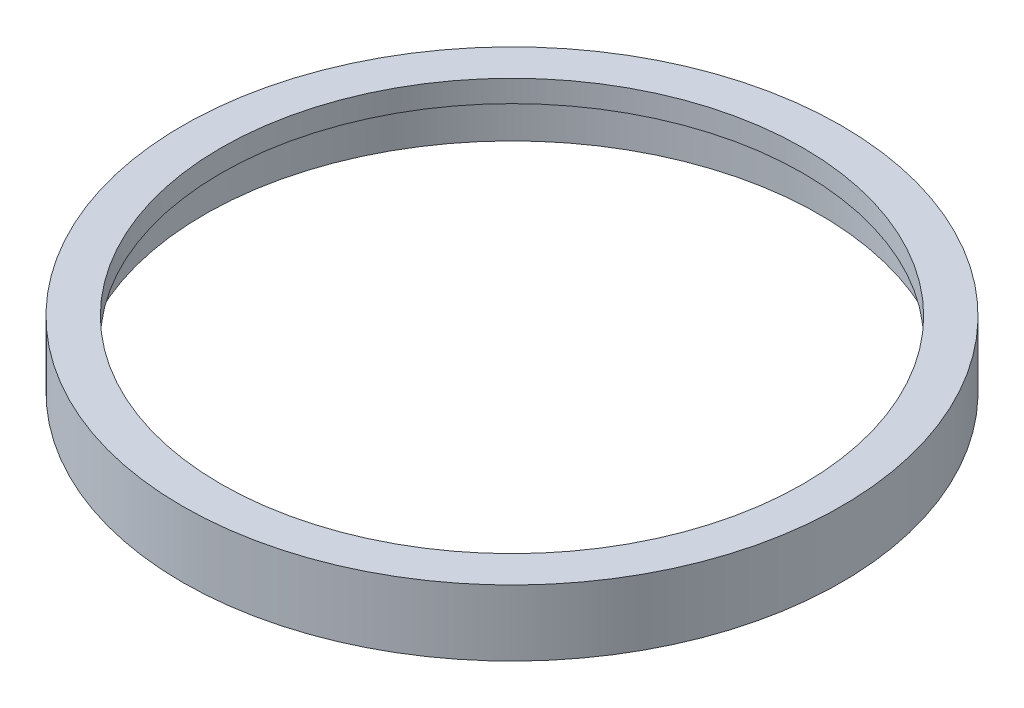
ISO-10303-21;
HEADER;
FILE_DESCRIPTION(('STEP AP214'),'2;1');
FILE_NAME('part.step','',(''),(''),'','','');
FILE_SCHEMA(('AUTOMOTIVE_DESIGN { 1 0 10303 214 1 1 1 1 }'));
ENDSEC;
DATA;
#1=APPLICATION_CONTEXT('core data for automotive mechanical design processes');
#2=APPLICATION_PROTOCOL_DEFINITION('international standard','automotive_design',2000,#1);
#3=PRODUCT_CONTEXT('',#1,'mechanical');
#4=PRODUCT('Part','Part','',(#3));
#5=PRODUCT_RELATED_PRODUCT_CATEGORY('part','',(#4));
#6=PRODUCT_DEFINITION_FORMATION('','',#4);
#7=PRODUCT_DEFINITION_CONTEXT('part definition',#1,'design');
#8=PRODUCT_DEFINITION('design','',#6,#7);
#9=PRODUCT_DEFINITION_SHAPE('','',#8);
#10=(LENGTH_UNIT() NAMED_UNIT(*) SI_UNIT(.MILLI.,.METRE.));
#11=(NAMED_UNIT(*) PLANE_ANGLE_UNIT() SI_UNIT($,.RADIAN.));
#12=(NAMED_UNIT(*) SI_UNIT($,.STERADIAN.) SOLID_ANGLE_UNIT());
#13=UNCERTAINTY_MEASURE_WITH_UNIT(LENGTH_MEASURE(1.E-05),#10,'distance_accuracy_value','');
#14=(GEOMETRIC_REPRESENTATION_CONTEXT(3) GLOBAL_UNCERTAINTY_ASSIGNED_CONTEXT((#13)) GLOBAL_UNIT_ASSIGNED_CONTEXT((#10,
#11,#12)) REPRESENTATION_CONTEXT('',''));
#15=CARTESIAN_POINT('',(0.,0.,0.));
#16=DIRECTION('',(0.,0.,1.));
#17=DIRECTION('',(1.,0.,0.));
#18=AXIS2_PLACEMENT_3D('',#15,#16,#17);
#19=CARTESIAN_POINT('',(0.,0.,0.));
#20=DIRECTION('',(0.,1.,0.));
#21=DIRECTION('',(0.,0.,1.));
#22=AXIS2_PLACEMENT_3D('',#19,#20,#21);
#23=PLANE('',#22);
#24=CARTESIAN_POINT('',(0.,0.,0.));
#25=DIRECTION('',(0.,1.,0.));
#26=DIRECTION('',(0.,0.,1.));
#27=AXIS2_PLACEMENT_3D('',#24,#25,#26);
#28=CIRCLE('',#27,15.);
#29=CARTESIAN_POINT('',(0.,0.,15.));
#30=VERTEX_POINT('',#29);
#31=EDGE_CURVE('E10',#30,#30,#28,.T.);
#32=ORIENTED_EDGE('',*,*,#31,.F.);
#33=EDGE_LOOP('',(#32));
#34=FACE_BOUND('',#33,.T.);
#35=CARTESIAN_POINT('',(0.,0.,0.));
#36=DIRECTION('',(0.,1.,0.));
#37=DIRECTION('',(0.,0.,1.));
#38=AXIS2_PLACEMENT_3D('',#35,#36,#37);
#39=CIRCLE('',#38,14.);
#40=CARTESIAN_POINT('',(0.,0.,14.));
#41=VERTEX_POINT('',#40);
#42=EDGE_CURVE('E38',#41,#41,#39,.T.);
#43=ORIENTED_EDGE('',*,*,#42,.T.);
#44=EDGE_LOOP('',(#43));
#45=FACE_BOUND('',#44,.T.);
#46=ADVANCED_FACE('F31',(#34,#45),#23,.F.);
#47=CARTESIAN_POINT('',(0.,2.,0.));
#48=DIRECTION('',(0.,-1.,0.));
#49=DIRECTION('',(0.,0.,-1.));
#50=AXIS2_PLACEMENT_3D('',#47,#48,#49);
#51=CYLINDRICAL_SURFACE('',#50,15.);
#52=ORIENTED_EDGE('',*,*,#31,.T.);
#53=EDGE_LOOP('',(#52));
#54=FACE_BOUND('',#53,.T.);
#55=CARTESIAN_POINT('',(0.,3.,0.));
#56=DIRECTION('',(0.,1.,0.));
#57=DIRECTION('',(0.,0.,1.));
#58=AXIS2_PLACEMENT_3D('',#55,#56,#57);
#59=CIRCLE('',#58,15.);
#60=CARTESIAN_POINT('',(0.,3.,15.));
#61=VERTEX_POINT('',#60);
#62=EDGE_CURVE('E46',#61,#61,#59,.T.);
#63=ORIENTED_EDGE('',*,*,#62,.F.);
#64=EDGE_LOOP('',(#63));
#65=FACE_BOUND('',#64,.T.);
#66=ADVANCED_FACE('F33',(#54,#65),#51,.T.);
#67=CARTESIAN_POINT('',(0.,2.,0.));
#68=DIRECTION('',(0.,-1.,0.));
#69=DIRECTION('',(0.,0.,-1.));
#70=AXIS2_PLACEMENT_3D('',#67,#68,#69);
#71=CYLINDRICAL_SURFACE('',#70,14.);
#72=CARTESIAN_POINT('',(0.,2.,0.));
#73=DIRECTION('',(0.,1.,0.));
#74=DIRECTION('',(0.,0.,1.));
#75=AXIS2_PLACEMENT_3D('',#72,#73,#74);
#76=CIRCLE('',#75,14.);
#77=CARTESIAN_POINT('',(0.,2.,14.));
#78=VERTEX_POINT('',#77);
#79=EDGE_CURVE('E42',#78,#78,#76,.T.);
#80=ORIENTED_EDGE('',*,*,#79,.T.);
#81=EDGE_LOOP('',(#80));
#82=FACE_BOUND('',#81,.T.);
#83=ORIENTED_EDGE('',*,*,#42,.F.);
#84=EDGE_LOOP('',(#83));
#85=FACE_BOUND('',#84,.T.);
#86=ADVANCED_FACE('F71',(#82,#85),#71,.F.);
#87=CARTESIAN_POINT('',(0.,2.,0.));
#88=DIRECTION('',(0.,1.,0.));
#89=DIRECTION('',(0.,0.,1.));
#90=AXIS2_PLACEMENT_3D('',#87,#88,#89);
#91=PLANE('',#90);
#92=CARTESIAN_POINT('',(0.,2.,0.));
#93=DIRECTION('',(0.,1.,0.));
#94=DIRECTION('',(0.,0.,1.));
#95=AXIS2_PLACEMENT_3D('',#92,#93,#94);
#96=CIRCLE('',#95,13.25);
#97=CARTESIAN_POINT('',(0.,2.,13.25));
#98=VERTEX_POINT('',#97);
#99=EDGE_CURVE('E52',#98,#98,#96,.T.);
#100=ORIENTED_EDGE('',*,*,#99,.T.);
#101=EDGE_LOOP('',(#100));
#102=FACE_BOUND('',#101,.T.);
#103=ORIENTED_EDGE('',*,*,#79,.F.);
#104=EDGE_LOOP('',(#103));
#105=FACE_BOUND('',#104,.T.);
#106=ADVANCED_FACE('F63',(#102,#105),#91,.F.);
#107=CARTESIAN_POINT('',(0.,3.,0.));
#108=DIRECTION('',(0.,1.,0.));
#109=DIRECTION('',(0.,0.,1.));
#110=AXIS2_PLACEMENT_3D('',#107,#108,#109);
#111=PLANE('',#110);
#112=ORIENTED_EDGE('',*,*,#62,.T.);
#113=EDGE_LOOP('',(#112));
#114=FACE_BOUND('',#113,.T.);
#115=CARTESIAN_POINT('',(0.,3.,0.));
#116=DIRECTION('',(0.,1.,0.));
#117=DIRECTION('',(0.,0.,1.));
#118=AXIS2_PLACEMENT_3D('',#115,#116,#117);
#119=CIRCLE('',#118,13.25);
#120=CARTESIAN_POINT('',(0.,3.,13.25));
#121=VERTEX_POINT('',#120);
#122=EDGE_CURVE('E51',#121,#121,#119,.T.);
#123=ORIENTED_EDGE('',*,*,#122,.F.);
#124=EDGE_LOOP('',(#123));
#125=FACE_BOUND('',#124,.T.);
#126=ADVANCED_FACE('F61',(#114,#125),#111,.T.);
#127=CARTESIAN_POINT('',(0.,3.,0.));
#128=DIRECTION('',(0.,-1.,0.));
#129=DIRECTION('',(0.,0.,-1.));
#130=AXIS2_PLACEMENT_3D('',#127,#128,#129);
#131=CYLINDRICAL_SURFACE('',#130,13.25);
#132=ORIENTED_EDGE('',*,*,#122,.T.);
#133=EDGE_LOOP('',(#132));
#134=FACE_BOUND('',#133,.T.);
#135=ORIENTED_EDGE('',*,*,#99,.F.);
#136=EDGE_LOOP('',(#135));
#137=FACE_BOUND('',#136,.T.);
#138=ADVANCED_FACE('F58',(#134,#137),#131,.F.);
#139=CLOSED_SHELL('',(#46,#66,#86,#106,#126,#138));
#140=MANIFOLD_SOLID_BREP('B2',#139);
#141=ADVANCED_BREP_SHAPE_REPRESENTATION('',(#18,#140),#14);
#142=SHAPE_DEFINITION_REPRESENTATION(#9,#141);
ENDSEC;
END-ISO-10303-21;
